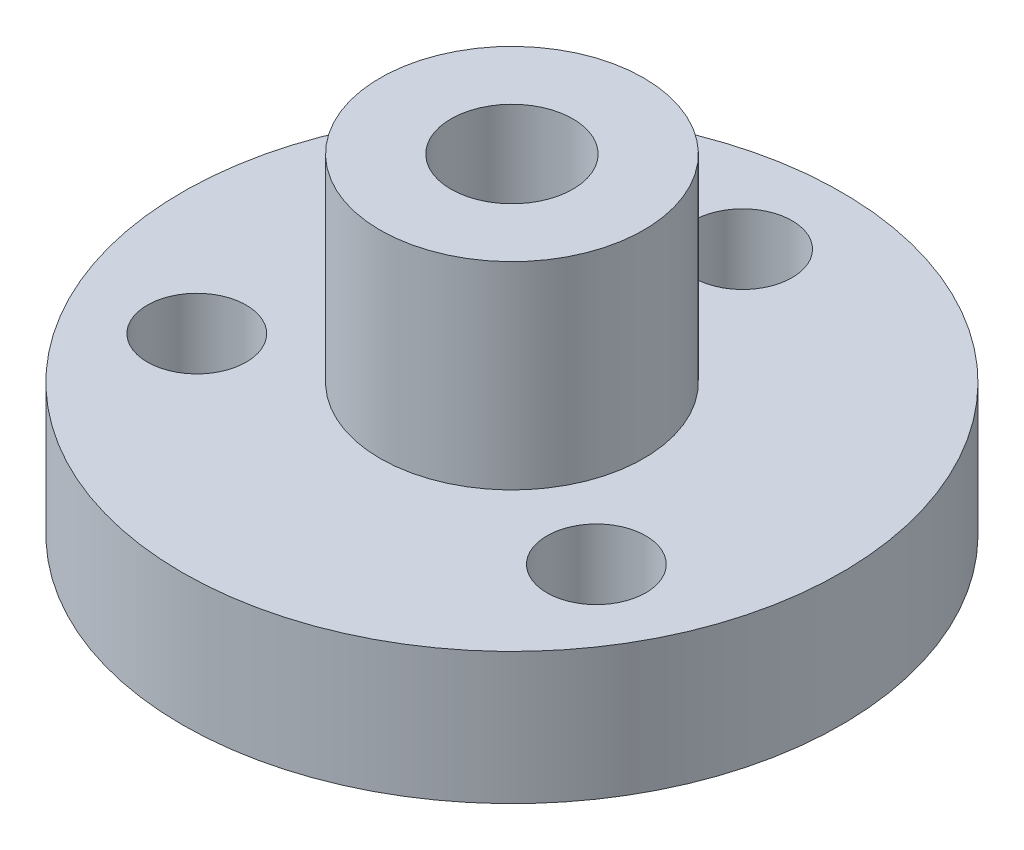
ISO-10303-21;
HEADER;
FILE_DESCRIPTION(('STEP AP214'),'2;1');
FILE_NAME('part.step','',(''),(''),'','','');
FILE_SCHEMA(('AUTOMOTIVE_DESIGN { 1 0 10303 214 1 1 1 1 }'));
ENDSEC;
DATA;
#1=APPLICATION_CONTEXT('core data for automotive mechanical design processes');
#2=APPLICATION_PROTOCOL_DEFINITION('international standard','automotive_design',2000,#1);
#3=PRODUCT_CONTEXT('',#1,'mechanical');
#4=PRODUCT('Part','Part','',(#3));
#5=PRODUCT_RELATED_PRODUCT_CATEGORY('part','',(#4));
#6=PRODUCT_DEFINITION_FORMATION('','',#4);
#7=PRODUCT_DEFINITION_CONTEXT('part definition',#1,'design');
#8=PRODUCT_DEFINITION('design','',#6,#7);
#9=PRODUCT_DEFINITION_SHAPE('','',#8);
#10=(LENGTH_UNIT() NAMED_UNIT(*) SI_UNIT(.MILLI.,.METRE.));
#11=(NAMED_UNIT(*) PLANE_ANGLE_UNIT() SI_UNIT($,.RADIAN.));
#12=(NAMED_UNIT(*) SI_UNIT($,.STERADIAN.) SOLID_ANGLE_UNIT());
#13=UNCERTAINTY_MEASURE_WITH_UNIT(LENGTH_MEASURE(1.E-05),#10,'distance_accuracy_value','');
#14=(GEOMETRIC_REPRESENTATION_CONTEXT(3) GLOBAL_UNCERTAINTY_ASSIGNED_CONTEXT((#13)) GLOBAL_UNIT_ASSIGNED_CONTEXT((#10,
#11,#12)) REPRESENTATION_CONTEXT('',''));
#15=CARTESIAN_POINT('',(0.,0.,0.));
#16=DIRECTION('',(0.,0.,1.));
#17=DIRECTION('',(1.,0.,0.));
#18=AXIS2_PLACEMENT_3D('',#15,#16,#17);
#19=CARTESIAN_POINT('',(0.,4.,0.));
#20=DIRECTION('',(0.,-1.,0.));
#21=DIRECTION('',(0.,0.,-1.));
#22=AXIS2_PLACEMENT_3D('',#19,#20,#21);
#23=CYLINDRICAL_SURFACE('',#22,10.);
#24=CARTESIAN_POINT('',(0.,4.,0.));
#25=DIRECTION('',(0.,1.,0.));
#26=DIRECTION('',(0.,0.,1.));
#27=AXIS2_PLACEMENT_3D('',#24,#25,#26);
#28=CIRCLE('',#27,10.);
#29=CARTESIAN_POINT('',(0.,4.,10.));
#30=VERTEX_POINT('',#29);
#31=EDGE_CURVE('E38',#30,#30,#28,.T.);
#32=ORIENTED_EDGE('',*,*,#31,.F.);
#33=EDGE_LOOP('',(#32));
#34=FACE_BOUND('',#33,.T.);
#35=CARTESIAN_POINT('',(0.,0.,0.));
#36=DIRECTION('',(0.,1.,0.));
#37=DIRECTION('',(0.,0.,1.));
#38=AXIS2_PLACEMENT_3D('',#35,#36,#37);
#39=CIRCLE('',#38,10.);
#40=CARTESIAN_POINT('',(0.,0.,10.));
#41=VERTEX_POINT('',#40);
#42=EDGE_CURVE('E34',#41,#41,#39,.T.);
#43=ORIENTED_EDGE('',*,*,#42,.T.);
#44=EDGE_LOOP('',(#43));
#45=FACE_BOUND('',#44,.T.);
#46=ADVANCED_FACE('F31',(#34,#45),#23,.T.);
#47=CARTESIAN_POINT('',(0.,4.,0.));
#48=DIRECTION('',(0.,1.,0.));
#49=DIRECTION('',(0.,0.,1.));
#50=AXIS2_PLACEMENT_3D('',#47,#48,#49);
#51=PLANE('',#50);
#52=CARTESIAN_POINT('',(6.06217782649106,4.,3.50000000000003));
#53=DIRECTION('',(0.,1.,0.));
#54=DIRECTION('',(-0.866025403784436,0.,-0.500000000000004));
#55=AXIS2_PLACEMENT_3D('',#52,#53,#54);
#56=CIRCLE('',#55,1.5);
#57=CARTESIAN_POINT('',(4.7631397208144,4.,2.75000000000002));
#58=VERTEX_POINT('',#57);
#59=EDGE_CURVE('E66',#58,#58,#56,.T.);
#60=ORIENTED_EDGE('',*,*,#59,.F.);
#61=EDGE_LOOP('',(#60));
#62=FACE_BOUND('',#61,.T.);
#63=CARTESIAN_POINT('',(-6.0621778264911,4.,3.49999999999994));
#64=DIRECTION('',(0.,1.,0.));
#65=DIRECTION('',(0.866025403784443,0.,-0.499999999999992));
#66=AXIS2_PLACEMENT_3D('',#63,#64,#65);
#67=CIRCLE('',#66,1.5);
#68=CARTESIAN_POINT('',(-4.76313972081444,4.,2.74999999999996));
#69=VERTEX_POINT('',#68);
#70=EDGE_CURVE('E60',#69,#69,#67,.T.);
#71=ORIENTED_EDGE('',*,*,#70,.F.);
#72=EDGE_LOOP('',(#71));
#73=FACE_BOUND('',#72,.T.);
#74=CARTESIAN_POINT('',(0.,4.,-7.));
#75=DIRECTION('',(0.,1.,0.));
#76=DIRECTION('',(0.,0.,1.));
#77=AXIS2_PLACEMENT_3D('',#74,#75,#76);
#78=CIRCLE('',#77,1.5);
#79=CARTESIAN_POINT('',(0.,4.,-5.5));
#80=VERTEX_POINT('',#79);
#81=EDGE_CURVE('E54',#80,#80,#78,.T.);
#82=ORIENTED_EDGE('',*,*,#81,.F.);
#83=EDGE_LOOP('',(#82));
#84=FACE_BOUND('',#83,.T.);
#85=CARTESIAN_POINT('',(0.,4.,0.));
#86=DIRECTION('',(0.,1.,0.));
#87=DIRECTION('',(0.,0.,1.));
#88=AXIS2_PLACEMENT_3D('',#85,#86,#87);
#89=CIRCLE('',#88,4.);
#90=CARTESIAN_POINT('',(0.,4.,4.));
#91=VERTEX_POINT('',#90);
#92=EDGE_CURVE('E10',#91,#91,#89,.T.);
#93=ORIENTED_EDGE('',*,*,#92,.F.);
#94=EDGE_LOOP('',(#93));
#95=FACE_BOUND('',#94,.T.);
#96=ORIENTED_EDGE('',*,*,#31,.T.);
#97=EDGE_LOOP('',(#96));
#98=FACE_BOUND('',#97,.T.);
#99=ADVANCED_FACE('F82',(#62,#73,#84,#95,#98),#51,.T.);
#100=CARTESIAN_POINT('',(0.,0.,0.));
#101=DIRECTION('',(0.,1.,0.));
#102=DIRECTION('',(0.,0.,1.));
#103=AXIS2_PLACEMENT_3D('',#100,#101,#102);
#104=PLANE('',#103);
#105=CARTESIAN_POINT('',(6.06217782649106,0.,3.50000000000003));
#106=DIRECTION('',(0.,1.,0.));
#107=DIRECTION('',(-0.866025403784436,0.,-0.500000000000004));
#108=AXIS2_PLACEMENT_3D('',#105,#106,#107);
#109=CIRCLE('',#108,1.5);
#110=CARTESIAN_POINT('',(4.7631397208144,0.,2.75000000000002));
#111=VERTEX_POINT('',#110);
#112=EDGE_CURVE('E57',#111,#111,#109,.T.);
#113=ORIENTED_EDGE('',*,*,#112,.T.);
#114=EDGE_LOOP('',(#113));
#115=FACE_BOUND('',#114,.T.);
#116=CARTESIAN_POINT('',(-6.0621778264911,0.,3.49999999999994));
#117=DIRECTION('',(0.,1.,0.));
#118=DIRECTION('',(0.866025403784443,0.,-0.499999999999992));
#119=AXIS2_PLACEMENT_3D('',#116,#117,#118);
#120=CIRCLE('',#119,1.5);
#121=CARTESIAN_POINT('',(-4.76313972081444,0.,2.74999999999996));
#122=VERTEX_POINT('',#121);
#123=EDGE_CURVE('E63',#122,#122,#120,.T.);
#124=ORIENTED_EDGE('',*,*,#123,.T.);
#125=EDGE_LOOP('',(#124));
#126=FACE_BOUND('',#125,.T.);
#127=CARTESIAN_POINT('',(0.,0.,-7.));
#128=DIRECTION('',(0.,1.,0.));
#129=DIRECTION('',(0.,0.,1.));
#130=AXIS2_PLACEMENT_3D('',#127,#128,#129);
#131=CIRCLE('',#130,1.5);
#132=CARTESIAN_POINT('',(0.,0.,-5.5));
#133=VERTEX_POINT('',#132);
#134=EDGE_CURVE('E51',#133,#133,#131,.T.);
#135=ORIENTED_EDGE('',*,*,#134,.T.);
#136=EDGE_LOOP('',(#135));
#137=FACE_BOUND('',#136,.T.);
#138=CARTESIAN_POINT('',(0.,0.,0.));
#139=DIRECTION('',(0.,1.,0.));
#140=DIRECTION('',(0.,0.,1.));
#141=AXIS2_PLACEMENT_3D('',#138,#139,#140);
#142=CIRCLE('',#141,1.85);
#143=CARTESIAN_POINT('',(0.,0.,1.85));
#144=VERTEX_POINT('',#143);
#145=EDGE_CURVE('E47',#144,#144,#142,.T.);
#146=ORIENTED_EDGE('',*,*,#145,.T.);
#147=EDGE_LOOP('',(#146));
#148=FACE_BOUND('',#147,.T.);
#149=ORIENTED_EDGE('',*,*,#42,.F.);
#150=EDGE_LOOP('',(#149));
#151=FACE_BOUND('',#150,.T.);
#152=ADVANCED_FACE('F72',(#115,#126,#137,#148,#151),#104,.F.);
#153=CARTESIAN_POINT('',(0.,10.,0.));
#154=DIRECTION('',(0.,-1.,0.));
#155=DIRECTION('',(0.,0.,-1.));
#156=AXIS2_PLACEMENT_3D('',#153,#154,#155);
#157=CYLINDRICAL_SURFACE('',#156,4.);
#158=CARTESIAN_POINT('',(0.,10.,0.));
#159=DIRECTION('',(0.,1.,0.));
#160=DIRECTION('',(0.,0.,1.));
#161=AXIS2_PLACEMENT_3D('',#158,#159,#160);
#162=CIRCLE('',#161,4.);
#163=CARTESIAN_POINT('',(0.,10.,4.));
#164=VERTEX_POINT('',#163);
#165=EDGE_CURVE('E44',#164,#164,#162,.T.);
#166=ORIENTED_EDGE('',*,*,#165,.F.);
#167=EDGE_LOOP('',(#166));
#168=FACE_BOUND('',#167,.T.);
#169=ORIENTED_EDGE('',*,*,#92,.T.);
#170=EDGE_LOOP('',(#169));
#171=FACE_BOUND('',#170,.T.);
#172=ADVANCED_FACE('F99',(#168,#171),#157,.T.);
#173=CARTESIAN_POINT('',(0.,10.,0.));
#174=DIRECTION('',(0.,1.,0.));
#175=DIRECTION('',(0.,0.,1.));
#176=AXIS2_PLACEMENT_3D('',#173,#174,#175);
#177=PLANE('',#176);
#178=CARTESIAN_POINT('',(0.,10.,0.));
#179=DIRECTION('',(0.,1.,0.));
#180=DIRECTION('',(0.,0.,1.));
#181=AXIS2_PLACEMENT_3D('',#178,#179,#180);
#182=CIRCLE('',#181,1.85);
#183=CARTESIAN_POINT('',(0.,10.,1.85));
#184=VERTEX_POINT('',#183);
#185=EDGE_CURVE('E48',#184,#184,#182,.T.);
#186=ORIENTED_EDGE('',*,*,#185,.F.);
#187=EDGE_LOOP('',(#186));
#188=FACE_BOUND('',#187,.T.);
#189=ORIENTED_EDGE('',*,*,#165,.T.);
#190=EDGE_LOOP('',(#189));
#191=FACE_BOUND('',#190,.T.);
#192=ADVANCED_FACE('F103',(#188,#191),#177,.T.);
#193=CARTESIAN_POINT('',(0.,0.,0.));
#194=DIRECTION('',(0.,1.,0.));
#195=DIRECTION('',(0.,0.,1.));
#196=AXIS2_PLACEMENT_3D('',#193,#194,#195);
#197=CYLINDRICAL_SURFACE('',#196,1.85);
#198=ORIENTED_EDGE('',*,*,#145,.F.);
#199=EDGE_LOOP('',(#198));
#200=FACE_BOUND('',#199,.T.);
#201=ORIENTED_EDGE('',*,*,#185,.T.);
#202=EDGE_LOOP('',(#201));
#203=FACE_BOUND('',#202,.T.);
#204=ADVANCED_FACE('F109',(#200,#203),#197,.F.);
#205=CARTESIAN_POINT('',(0.,0.,-7.));
#206=DIRECTION('',(0.,1.,0.));
#207=DIRECTION('',(0.,0.,1.));
#208=AXIS2_PLACEMENT_3D('',#205,#206,#207);
#209=CYLINDRICAL_SURFACE('',#208,1.5);
#210=ORIENTED_EDGE('',*,*,#134,.F.);
#211=EDGE_LOOP('',(#210));
#212=FACE_BOUND('',#211,.T.);
#213=ORIENTED_EDGE('',*,*,#81,.T.);
#214=EDGE_LOOP('',(#213));
#215=FACE_BOUND('',#214,.T.);
#216=ADVANCED_FACE('F113',(#212,#215),#209,.F.);
#217=CARTESIAN_POINT('',(-6.0621778264911,0.,3.49999999999994));
#218=DIRECTION('',(0.,1.,0.));
#219=DIRECTION('',(0.,0.,1.));
#220=AXIS2_PLACEMENT_3D('',#217,#218,#219);
#221=CYLINDRICAL_SURFACE('',#220,1.5);
#222=ORIENTED_EDGE('',*,*,#123,.F.);
#223=EDGE_LOOP('',(#222));
#224=FACE_BOUND('',#223,.T.);
#225=ORIENTED_EDGE('',*,*,#70,.T.);
#226=EDGE_LOOP('',(#225));
#227=FACE_BOUND('',#226,.T.);
#228=ADVANCED_FACE('F78',(#224,#227),#221,.F.);
#229=CARTESIAN_POINT('',(6.06217782649106,0.,3.50000000000003));
#230=DIRECTION('',(0.,1.,0.));
#231=DIRECTION('',(0.,0.,1.));
#232=AXIS2_PLACEMENT_3D('',#229,#230,#231);
#233=CYLINDRICAL_SURFACE('',#232,1.5);
#234=ORIENTED_EDGE('',*,*,#112,.F.);
#235=EDGE_LOOP('',(#234));
#236=FACE_BOUND('',#235,.T.);
#237=ORIENTED_EDGE('',*,*,#59,.T.);
#238=EDGE_LOOP('',(#237));
#239=FACE_BOUND('',#238,.T.);
#240=ADVANCED_FACE('F75',(#236,#239),#233,.F.);
#241=CLOSED_SHELL('',(#46,#99,#152,#172,#192,#204,#216,#228,#240));
#242=MANIFOLD_SOLID_BREP('B2',#241);
#243=ADVANCED_BREP_SHAPE_REPRESENTATION('',(#18,#242),#14);
#244=SHAPE_DEFINITION_REPRESENTATION(#9,#243);
ENDSEC;
END-ISO-10303-21;
